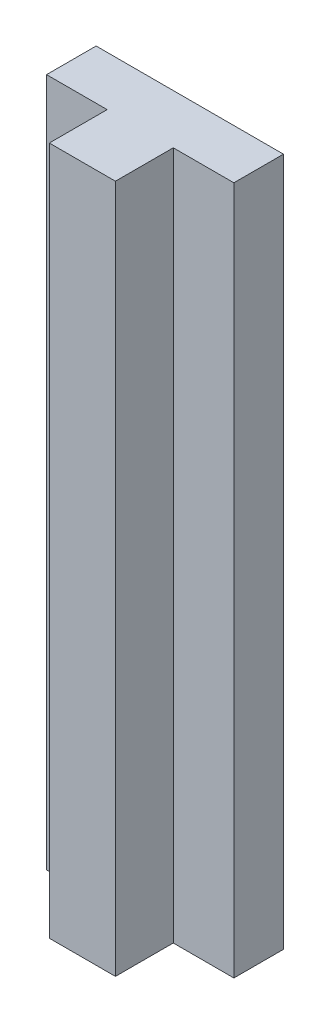
ISO-10303-21;
HEADER;
FILE_DESCRIPTION(('STEP AP214'),'2;1');
FILE_NAME('part.step','',(''),(''),'','','');
FILE_SCHEMA(('AUTOMOTIVE_DESIGN { 1 0 10303 214 1 1 1 1 }'));
ENDSEC;
DATA;
#1=APPLICATION_CONTEXT('core data for automotive mechanical design processes');
#2=APPLICATION_PROTOCOL_DEFINITION('international standard','automotive_design',2000,#1);
#3=PRODUCT_CONTEXT('',#1,'mechanical');
#4=PRODUCT('Part','Part','',(#3));
#5=PRODUCT_RELATED_PRODUCT_CATEGORY('part','',(#4));
#6=PRODUCT_DEFINITION_FORMATION('','',#4);
#7=PRODUCT_DEFINITION_CONTEXT('part definition',#1,'design');
#8=PRODUCT_DEFINITION('design','',#6,#7);
#9=PRODUCT_DEFINITION_SHAPE('','',#8);
#10=(LENGTH_UNIT() NAMED_UNIT(*) SI_UNIT(.MILLI.,.METRE.));
#11=(NAMED_UNIT(*) PLANE_ANGLE_UNIT() SI_UNIT($,.RADIAN.));
#12=(NAMED_UNIT(*) SI_UNIT($,.STERADIAN.) SOLID_ANGLE_UNIT());
#13=UNCERTAINTY_MEASURE_WITH_UNIT(LENGTH_MEASURE(1.E-05),#10,'distance_accuracy_value','');
#14=(GEOMETRIC_REPRESENTATION_CONTEXT(3) GLOBAL_UNCERTAINTY_ASSIGNED_CONTEXT((#13)) GLOBAL_UNIT_ASSIGNED_CONTEXT((#10,
#11,#12)) REPRESENTATION_CONTEXT('',''));
#15=CARTESIAN_POINT('',(0.,0.,0.));
#16=DIRECTION('',(0.,0.,1.));
#17=DIRECTION('',(1.,0.,0.));
#18=AXIS2_PLACEMENT_3D('',#15,#16,#17);
#19=CARTESIAN_POINT('',(-2.4,50.,0.));
#20=DIRECTION('',(0.,0.,-1.));
#21=DIRECTION('',(-1.,0.,0.));
#22=AXIS2_PLACEMENT_3D('',#19,#20,#21);
#23=PLANE('',#22);
#24=DIRECTION('',(1.,0.,0.));
#25=VECTOR('',#24,1.);
#26=CARTESIAN_POINT('',(-2.4,0.,0.));
#27=LINE('',#26,#25);
#28=CARTESIAN_POINT('',(-2.4,0.,0.));
#29=VERTEX_POINT('',#28);
#30=CARTESIAN_POINT('',(2.4,0.,0.));
#31=VERTEX_POINT('',#30);
#32=EDGE_CURVE('E146',#29,#31,#27,.T.);
#33=ORIENTED_EDGE('',*,*,#32,.T.);
#34=DIRECTION('',(0.,-1.,0.));
#35=VECTOR('',#34,1.);
#36=CARTESIAN_POINT('',(2.4,50.,0.));
#37=LINE('',#36,#35);
#38=CARTESIAN_POINT('',(2.4,50.,0.));
#39=VERTEX_POINT('',#38);
#40=EDGE_CURVE('E11',#39,#31,#37,.T.);
#41=ORIENTED_EDGE('',*,*,#40,.F.);
#42=DIRECTION('',(1.,0.,0.));
#43=VECTOR('',#42,1.);
#44=CARTESIAN_POINT('',(-2.4,50.,0.));
#45=LINE('',#44,#43);
#46=CARTESIAN_POINT('',(-2.4,50.,0.));
#47=VERTEX_POINT('',#46);
#48=EDGE_CURVE('E169',#47,#39,#45,.T.);
#49=ORIENTED_EDGE('',*,*,#48,.F.);
#50=DIRECTION('',(0.,-1.,0.));
#51=VECTOR('',#50,1.);
#52=CARTESIAN_POINT('',(-2.4,50.,0.));
#53=LINE('',#52,#51);
#54=EDGE_CURVE('E142',#47,#29,#53,.T.);
#55=ORIENTED_EDGE('',*,*,#54,.T.);
#56=EDGE_LOOP('',(#33,#41,#49,#55));
#57=FACE_BOUND('',#56,.T.);
#58=ADVANCED_FACE('F45',(#57),#23,.F.);
#59=CARTESIAN_POINT('',(2.4,50.,0.));
#60=DIRECTION('',(-1.,0.,0.));
#61=DIRECTION('',(0.,0.,1.));
#62=AXIS2_PLACEMENT_3D('',#59,#60,#61);
#63=PLANE('',#62);
#64=DIRECTION('',(0.,0.,-1.));
#65=VECTOR('',#64,1.);
#66=CARTESIAN_POINT('',(2.4,0.,0.));
#67=LINE('',#66,#65);
#68=CARTESIAN_POINT('',(2.4,0.,-4.2));
#69=VERTEX_POINT('',#68);
#70=EDGE_CURVE('E150',#31,#69,#67,.T.);
#71=ORIENTED_EDGE('',*,*,#70,.T.);
#72=DIRECTION('',(0.,-1.,0.));
#73=VECTOR('',#72,1.);
#74=CARTESIAN_POINT('',(2.4,50.,-4.2));
#75=LINE('',#74,#73);
#76=CARTESIAN_POINT('',(2.4,50.,-4.2));
#77=VERTEX_POINT('',#76);
#78=EDGE_CURVE('E54',#77,#69,#75,.T.);
#79=ORIENTED_EDGE('',*,*,#78,.F.);
#80=DIRECTION('',(0.,0.,-1.));
#81=VECTOR('',#80,1.);
#82=CARTESIAN_POINT('',(2.4,50.,0.));
#83=LINE('',#82,#81);
#84=EDGE_CURVE('E105',#39,#77,#83,.T.);
#85=ORIENTED_EDGE('',*,*,#84,.F.);
#86=ORIENTED_EDGE('',*,*,#40,.T.);
#87=EDGE_LOOP('',(#71,#79,#85,#86));
#88=FACE_BOUND('',#87,.T.);
#89=ADVANCED_FACE('F214',(#88),#63,.F.);
#90=CARTESIAN_POINT('',(2.4,50.,-4.2));
#91=DIRECTION('',(0.,0.,-1.));
#92=DIRECTION('',(-1.,0.,0.));
#93=AXIS2_PLACEMENT_3D('',#90,#91,#92);
#94=PLANE('',#93);
#95=DIRECTION('',(1.,0.,0.));
#96=VECTOR('',#95,1.);
#97=CARTESIAN_POINT('',(2.4,0.,-4.2));
#98=LINE('',#97,#96);
#99=CARTESIAN_POINT('',(6.8,0.,-4.2));
#100=VERTEX_POINT('',#99);
#101=EDGE_CURVE('E153',#69,#100,#98,.T.);
#102=ORIENTED_EDGE('',*,*,#101,.T.);
#103=DIRECTION('',(0.,-1.,0.));
#104=VECTOR('',#103,1.);
#105=CARTESIAN_POINT('',(6.8,50.,-4.2));
#106=LINE('',#105,#104);
#107=CARTESIAN_POINT('',(6.8,50.,-4.2));
#108=VERTEX_POINT('',#107);
#109=EDGE_CURVE('E180',#108,#100,#106,.T.);
#110=ORIENTED_EDGE('',*,*,#109,.F.);
#111=DIRECTION('',(1.,0.,0.));
#112=VECTOR('',#111,1.);
#113=CARTESIAN_POINT('',(2.4,50.,-4.2));
#114=LINE('',#113,#112);
#115=EDGE_CURVE('E190',#77,#108,#114,.T.);
#116=ORIENTED_EDGE('',*,*,#115,.F.);
#117=ORIENTED_EDGE('',*,*,#78,.T.);
#118=EDGE_LOOP('',(#102,#110,#116,#117));
#119=FACE_BOUND('',#118,.T.);
#120=ADVANCED_FACE('F188',(#119),#94,.F.);
#121=CARTESIAN_POINT('',(6.8,50.,-4.2));
#122=DIRECTION('',(-1.,0.,0.));
#123=DIRECTION('',(0.,0.,1.));
#124=AXIS2_PLACEMENT_3D('',#121,#122,#123);
#125=PLANE('',#124);
#126=DIRECTION('',(0.,0.,-1.));
#127=VECTOR('',#126,1.);
#128=CARTESIAN_POINT('',(6.8,0.,-4.2));
#129=LINE('',#128,#127);
#130=CARTESIAN_POINT('',(6.8,0.,-7.8));
#131=VERTEX_POINT('',#130);
#132=EDGE_CURVE('E156',#100,#131,#129,.T.);
#133=ORIENTED_EDGE('',*,*,#132,.T.);
#134=DIRECTION('',(0.,-1.,0.));
#135=VECTOR('',#134,1.);
#136=CARTESIAN_POINT('',(6.8,50.,-7.8));
#137=LINE('',#136,#135);
#138=CARTESIAN_POINT('',(6.8,50.,-7.8));
#139=VERTEX_POINT('',#138);
#140=EDGE_CURVE('E176',#139,#131,#137,.T.);
#141=ORIENTED_EDGE('',*,*,#140,.F.);
#142=DIRECTION('',(0.,0.,-1.));
#143=VECTOR('',#142,1.);
#144=CARTESIAN_POINT('',(6.8,50.,-4.2));
#145=LINE('',#144,#143);
#146=EDGE_CURVE('E202',#108,#139,#145,.T.);
#147=ORIENTED_EDGE('',*,*,#146,.F.);
#148=ORIENTED_EDGE('',*,*,#109,.T.);
#149=EDGE_LOOP('',(#133,#141,#147,#148));
#150=FACE_BOUND('',#149,.T.);
#151=ADVANCED_FACE('F197',(#150),#125,.F.);
#152=CARTESIAN_POINT('',(-6.8,50.,-7.8));
#153=DIRECTION('',(0.,0.,1.));
#154=DIRECTION('',(1.,0.,0.));
#155=AXIS2_PLACEMENT_3D('',#152,#153,#154);
#156=PLANE('',#155);
#157=DIRECTION('',(-1.,0.,0.));
#158=VECTOR('',#157,1.);
#159=CARTESIAN_POINT('',(-6.8,0.,-7.8));
#160=LINE('',#159,#158);
#161=CARTESIAN_POINT('',(-6.8,0.,-7.8));
#162=VERTEX_POINT('',#161);
#163=EDGE_CURVE('E160',#131,#162,#160,.T.);
#164=ORIENTED_EDGE('',*,*,#163,.T.);
#165=DIRECTION('',(0.,-1.,0.));
#166=VECTOR('',#165,1.);
#167=CARTESIAN_POINT('',(-6.8,50.,-7.8));
#168=LINE('',#167,#166);
#169=CARTESIAN_POINT('',(-6.8,50.,-7.8));
#170=VERTEX_POINT('',#169);
#171=EDGE_CURVE('E135',#170,#162,#168,.T.);
#172=ORIENTED_EDGE('',*,*,#171,.F.);
#173=DIRECTION('',(-1.,0.,0.));
#174=VECTOR('',#173,1.);
#175=CARTESIAN_POINT('',(6.8,50.,-7.8));
#176=LINE('',#175,#174);
#177=EDGE_CURVE('E124',#139,#170,#176,.T.);
#178=ORIENTED_EDGE('',*,*,#177,.F.);
#179=ORIENTED_EDGE('',*,*,#140,.T.);
#180=EDGE_LOOP('',(#164,#172,#178,#179));
#181=FACE_BOUND('',#180,.T.);
#182=ADVANCED_FACE('F200',(#181),#156,.F.);
#183=CARTESIAN_POINT('',(-6.8,50.,-4.2));
#184=DIRECTION('',(1.,0.,0.));
#185=DIRECTION('',(0.,0.,-1.));
#186=AXIS2_PLACEMENT_3D('',#183,#184,#185);
#187=PLANE('',#186);
#188=DIRECTION('',(0.,0.,1.));
#189=VECTOR('',#188,1.);
#190=CARTESIAN_POINT('',(-6.8,0.,-4.2));
#191=LINE('',#190,#189);
#192=CARTESIAN_POINT('',(-6.8,0.,-4.2));
#193=VERTEX_POINT('',#192);
#194=EDGE_CURVE('E133',#162,#193,#191,.T.);
#195=ORIENTED_EDGE('',*,*,#194,.T.);
#196=DIRECTION('',(0.,-1.,0.));
#197=VECTOR('',#196,1.);
#198=CARTESIAN_POINT('',(-6.8,50.,-4.2));
#199=LINE('',#198,#197);
#200=CARTESIAN_POINT('',(-6.8,50.,-4.2));
#201=VERTEX_POINT('',#200);
#202=EDGE_CURVE('E130',#201,#193,#199,.T.);
#203=ORIENTED_EDGE('',*,*,#202,.F.);
#204=DIRECTION('',(0.,0.,1.));
#205=VECTOR('',#204,1.);
#206=CARTESIAN_POINT('',(-6.8,50.,-4.2));
#207=LINE('',#206,#205);
#208=EDGE_CURVE('E118',#170,#201,#207,.T.);
#209=ORIENTED_EDGE('',*,*,#208,.F.);
#210=ORIENTED_EDGE('',*,*,#171,.T.);
#211=EDGE_LOOP('',(#195,#203,#209,#210));
#212=FACE_BOUND('',#211,.T.);
#213=ADVANCED_FACE('F131',(#212),#187,.F.);
#214=CARTESIAN_POINT('',(-2.4,50.,-4.2));
#215=DIRECTION('',(0.,0.,-1.));
#216=DIRECTION('',(-1.,0.,0.));
#217=AXIS2_PLACEMENT_3D('',#214,#215,#216);
#218=PLANE('',#217);
#219=DIRECTION('',(1.,0.,0.));
#220=VECTOR('',#219,1.);
#221=CARTESIAN_POINT('',(-2.4,0.,-4.2));
#222=LINE('',#221,#220);
#223=CARTESIAN_POINT('',(-2.4,0.,-4.2));
#224=VERTEX_POINT('',#223);
#225=EDGE_CURVE('E91',#193,#224,#222,.T.);
#226=ORIENTED_EDGE('',*,*,#225,.T.);
#227=DIRECTION('',(0.,-1.,0.));
#228=VECTOR('',#227,1.);
#229=CARTESIAN_POINT('',(-2.4,50.,-4.2));
#230=LINE('',#229,#228);
#231=CARTESIAN_POINT('',(-2.4,50.,-4.2));
#232=VERTEX_POINT('',#231);
#233=EDGE_CURVE('E136',#232,#224,#230,.T.);
#234=ORIENTED_EDGE('',*,*,#233,.F.);
#235=DIRECTION('',(1.,0.,0.));
#236=VECTOR('',#235,1.);
#237=CARTESIAN_POINT('',(-2.4,50.,-4.2));
#238=LINE('',#237,#236);
#239=EDGE_CURVE('E122',#201,#232,#238,.T.);
#240=ORIENTED_EDGE('',*,*,#239,.F.);
#241=ORIENTED_EDGE('',*,*,#202,.T.);
#242=EDGE_LOOP('',(#226,#234,#240,#241));
#243=FACE_BOUND('',#242,.T.);
#244=ADVANCED_FACE('F138',(#243),#218,.F.);
#245=CARTESIAN_POINT('',(-2.4,50.,0.));
#246=DIRECTION('',(1.,0.,0.));
#247=DIRECTION('',(0.,0.,-1.));
#248=AXIS2_PLACEMENT_3D('',#245,#246,#247);
#249=PLANE('',#248);
#250=DIRECTION('',(0.,0.,1.));
#251=VECTOR('',#250,1.);
#252=CARTESIAN_POINT('',(-2.4,0.,0.));
#253=LINE('',#252,#251);
#254=EDGE_CURVE('E97',#224,#29,#253,.T.);
#255=ORIENTED_EDGE('',*,*,#254,.T.);
#256=ORIENTED_EDGE('',*,*,#54,.F.);
#257=DIRECTION('',(0.,0.,1.));
#258=VECTOR('',#257,1.);
#259=CARTESIAN_POINT('',(-2.4,50.,0.));
#260=LINE('',#259,#258);
#261=EDGE_CURVE('E62',#232,#47,#260,.T.);
#262=ORIENTED_EDGE('',*,*,#261,.F.);
#263=ORIENTED_EDGE('',*,*,#233,.T.);
#264=EDGE_LOOP('',(#255,#256,#262,#263));
#265=FACE_BOUND('',#264,.T.);
#266=ADVANCED_FACE('F230',(#265),#249,.F.);
#267=CARTESIAN_POINT('',(0.,50.,0.));
#268=DIRECTION('',(0.,1.,0.));
#269=DIRECTION('',(0.,0.,1.));
#270=AXIS2_PLACEMENT_3D('',#267,#268,#269);
#271=PLANE('',#270);
#272=ORIENTED_EDGE('',*,*,#48,.T.);
#273=ORIENTED_EDGE('',*,*,#84,.T.);
#274=ORIENTED_EDGE('',*,*,#115,.T.);
#275=ORIENTED_EDGE('',*,*,#146,.T.);
#276=ORIENTED_EDGE('',*,*,#177,.T.);
#277=ORIENTED_EDGE('',*,*,#208,.T.);
#278=ORIENTED_EDGE('',*,*,#239,.T.);
#279=ORIENTED_EDGE('',*,*,#261,.T.);
#280=EDGE_LOOP('',(#272,#273,#274,#275,#276,#277,#278,#279));
#281=FACE_BOUND('',#280,.T.);
#282=ADVANCED_FACE('F120',(#281),#271,.T.);
#283=CARTESIAN_POINT('',(0.,0.,0.));
#284=DIRECTION('',(0.,1.,0.));
#285=DIRECTION('',(0.,0.,1.));
#286=AXIS2_PLACEMENT_3D('',#283,#284,#285);
#287=PLANE('',#286);
#288=ORIENTED_EDGE('',*,*,#32,.F.);
#289=ORIENTED_EDGE('',*,*,#254,.F.);
#290=ORIENTED_EDGE('',*,*,#225,.F.);
#291=ORIENTED_EDGE('',*,*,#194,.F.);
#292=ORIENTED_EDGE('',*,*,#163,.F.);
#293=ORIENTED_EDGE('',*,*,#132,.F.);
#294=ORIENTED_EDGE('',*,*,#101,.F.);
#295=ORIENTED_EDGE('',*,*,#70,.F.);
#296=EDGE_LOOP('',(#288,#289,#290,#291,#292,#293,#294,#295));
#297=FACE_BOUND('',#296,.T.);
#298=ADVANCED_FACE('F194',(#297),#287,.F.);
#299=CLOSED_SHELL('',(#58,#89,#120,#151,#182,#213,#244,#266,#282,#298));
#300=MANIFOLD_SOLID_BREP('B2',#299);
#301=ADVANCED_BREP_SHAPE_REPRESENTATION('',(#18,#300),#14);
#302=SHAPE_DEFINITION_REPRESENTATION(#9,#301);
ENDSEC;
END-ISO-10303-21;
